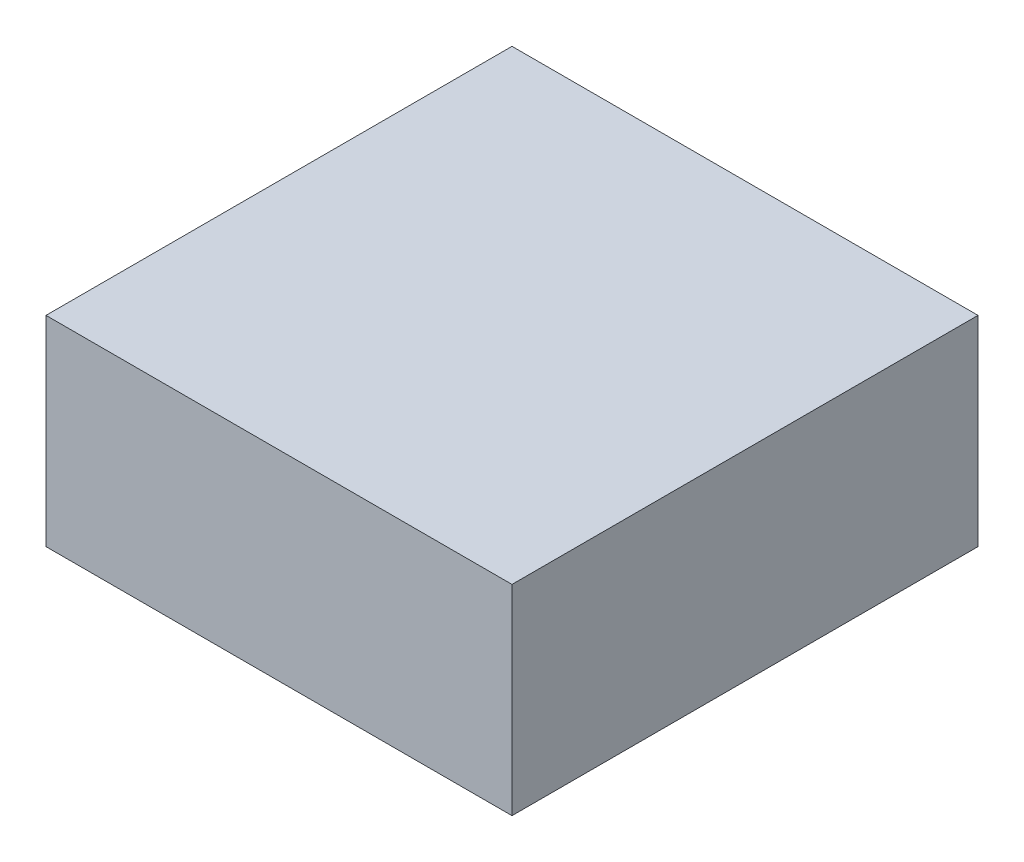
ISO-10303-21;
HEADER;
FILE_DESCRIPTION(('STEP AP214'),'2;1');
FILE_NAME('part.step','',(''),(''),'','','');
FILE_SCHEMA(('AUTOMOTIVE_DESIGN { 1 0 10303 214 1 1 1 1 }'));
ENDSEC;
DATA;
#1=APPLICATION_CONTEXT('core data for automotive mechanical design processes');
#2=APPLICATION_PROTOCOL_DEFINITION('international standard','automotive_design',2000,#1);
#3=PRODUCT_CONTEXT('',#1,'mechanical');
#4=PRODUCT('Part','Part','',(#3));
#5=PRODUCT_RELATED_PRODUCT_CATEGORY('part','',(#4));
#6=PRODUCT_DEFINITION_FORMATION('','',#4);
#7=PRODUCT_DEFINITION_CONTEXT('part definition',#1,'design');
#8=PRODUCT_DEFINITION('design','',#6,#7);
#9=PRODUCT_DEFINITION_SHAPE('','',#8);
#10=(LENGTH_UNIT() NAMED_UNIT(*) SI_UNIT(.MILLI.,.METRE.));
#11=(NAMED_UNIT(*) PLANE_ANGLE_UNIT() SI_UNIT($,.RADIAN.));
#12=(NAMED_UNIT(*) SI_UNIT($,.STERADIAN.) SOLID_ANGLE_UNIT());
#13=UNCERTAINTY_MEASURE_WITH_UNIT(LENGTH_MEASURE(1.E-05),#10,'distance_accuracy_value','');
#14=(GEOMETRIC_REPRESENTATION_CONTEXT(3) GLOBAL_UNCERTAINTY_ASSIGNED_CONTEXT((#13)) GLOBAL_UNIT_ASSIGNED_CONTEXT((#10,
#11,#12)) REPRESENTATION_CONTEXT('',''));
#15=CARTESIAN_POINT('',(0.,0.,0.));
#16=DIRECTION('',(0.,0.,1.));
#17=DIRECTION('',(1.,0.,0.));
#18=AXIS2_PLACEMENT_3D('',#15,#16,#17);
#19=CARTESIAN_POINT('',(0.,24.892,0.));
#20=DIRECTION('',(1.,0.,0.));
#21=DIRECTION('',(0.,0.,-1.));
#22=AXIS2_PLACEMENT_3D('',#19,#20,#21);
#23=PLANE('',#22);
#24=DIRECTION('',(0.,0.,1.));
#25=VECTOR('',#24,1.);
#26=CARTESIAN_POINT('',(0.,0.,0.));
#27=LINE('',#26,#25);
#28=CARTESIAN_POINT('',(0.,0.,-57.912));
#29=VERTEX_POINT('',#28);
#30=CARTESIAN_POINT('',(0.,0.,0.));
#31=VERTEX_POINT('',#30);
#32=EDGE_CURVE('E96',#29,#31,#27,.T.);
#33=ORIENTED_EDGE('',*,*,#32,.T.);
#34=DIRECTION('',(0.,-1.,0.));
#35=VECTOR('',#34,1.);
#36=CARTESIAN_POINT('',(0.,24.892,0.));
#37=LINE('',#36,#35);
#38=CARTESIAN_POINT('',(0.,24.892,0.));
#39=VERTEX_POINT('',#38);
#40=EDGE_CURVE('E11',#39,#31,#37,.T.);
#41=ORIENTED_EDGE('',*,*,#40,.F.);
#42=DIRECTION('',(0.,0.,1.));
#43=VECTOR('',#42,1.);
#44=CARTESIAN_POINT('',(0.,24.892,0.));
#45=LINE('',#44,#43);
#46=CARTESIAN_POINT('',(0.,24.892,-57.912));
#47=VERTEX_POINT('',#46);
#48=EDGE_CURVE('E84',#47,#39,#45,.T.);
#49=ORIENTED_EDGE('',*,*,#48,.F.);
#50=DIRECTION('',(0.,-1.,0.));
#51=VECTOR('',#50,1.);
#52=CARTESIAN_POINT('',(0.,24.892,-57.912));
#53=LINE('',#52,#51);
#54=EDGE_CURVE('E92',#47,#29,#53,.T.);
#55=ORIENTED_EDGE('',*,*,#54,.T.);
#56=EDGE_LOOP('',(#33,#41,#49,#55));
#57=FACE_BOUND('',#56,.T.);
#58=ADVANCED_FACE('F33',(#57),#23,.F.);
#59=CARTESIAN_POINT('',(0.,24.892,0.));
#60=DIRECTION('',(0.,0.,-1.));
#61=DIRECTION('',(-1.,0.,0.));
#62=AXIS2_PLACEMENT_3D('',#59,#60,#61);
#63=PLANE('',#62);
#64=DIRECTION('',(1.,0.,0.));
#65=VECTOR('',#64,1.);
#66=CARTESIAN_POINT('',(0.,0.,0.));
#67=LINE('',#66,#65);
#68=CARTESIAN_POINT('',(57.912,0.,0.));
#69=VERTEX_POINT('',#68);
#70=EDGE_CURVE('E88',#31,#69,#67,.T.);
#71=ORIENTED_EDGE('',*,*,#70,.T.);
#72=DIRECTION('',(0.,-1.,0.));
#73=VECTOR('',#72,1.);
#74=CARTESIAN_POINT('',(57.912,24.892,0.));
#75=LINE('',#74,#73);
#76=CARTESIAN_POINT('',(57.912,24.892,0.));
#77=VERTEX_POINT('',#76);
#78=EDGE_CURVE('E41',#77,#69,#75,.T.);
#79=ORIENTED_EDGE('',*,*,#78,.F.);
#80=DIRECTION('',(1.,0.,0.));
#81=VECTOR('',#80,1.);
#82=CARTESIAN_POINT('',(0.,24.892,0.));
#83=LINE('',#82,#81);
#84=EDGE_CURVE('E79',#39,#77,#83,.T.);
#85=ORIENTED_EDGE('',*,*,#84,.F.);
#86=ORIENTED_EDGE('',*,*,#40,.T.);
#87=EDGE_LOOP('',(#71,#79,#85,#86));
#88=FACE_BOUND('',#87,.T.);
#89=ADVANCED_FACE('F87',(#88),#63,.F.);
#90=CARTESIAN_POINT('',(57.912,24.892,0.));
#91=DIRECTION('',(-1.,0.,0.));
#92=DIRECTION('',(0.,0.,1.));
#93=AXIS2_PLACEMENT_3D('',#90,#91,#92);
#94=PLANE('',#93);
#95=DIRECTION('',(0.,0.,-1.));
#96=VECTOR('',#95,1.);
#97=CARTESIAN_POINT('',(57.912,0.,0.));
#98=LINE('',#97,#96);
#99=CARTESIAN_POINT('',(57.912,0.,-57.912));
#100=VERTEX_POINT('',#99);
#101=EDGE_CURVE('E66',#69,#100,#98,.T.);
#102=ORIENTED_EDGE('',*,*,#101,.T.);
#103=DIRECTION('',(0.,-1.,0.));
#104=VECTOR('',#103,1.);
#105=CARTESIAN_POINT('',(57.912,24.892,-57.912));
#106=LINE('',#105,#104);
#107=CARTESIAN_POINT('',(57.912,24.892,-57.912));
#108=VERTEX_POINT('',#107);
#109=EDGE_CURVE('E89',#108,#100,#106,.T.);
#110=ORIENTED_EDGE('',*,*,#109,.F.);
#111=DIRECTION('',(0.,0.,-1.));
#112=VECTOR('',#111,1.);
#113=CARTESIAN_POINT('',(57.912,24.892,0.));
#114=LINE('',#113,#112);
#115=EDGE_CURVE('E82',#77,#108,#114,.T.);
#116=ORIENTED_EDGE('',*,*,#115,.F.);
#117=ORIENTED_EDGE('',*,*,#78,.T.);
#118=EDGE_LOOP('',(#102,#110,#116,#117));
#119=FACE_BOUND('',#118,.T.);
#120=ADVANCED_FACE('F90',(#119),#94,.F.);
#121=CARTESIAN_POINT('',(0.,24.892,-57.912));
#122=DIRECTION('',(0.,0.,1.));
#123=DIRECTION('',(1.,0.,0.));
#124=AXIS2_PLACEMENT_3D('',#121,#122,#123);
#125=PLANE('',#124);
#126=DIRECTION('',(-1.,0.,0.));
#127=VECTOR('',#126,1.);
#128=CARTESIAN_POINT('',(0.,0.,-57.912));
#129=LINE('',#128,#127);
#130=EDGE_CURVE('E72',#100,#29,#129,.T.);
#131=ORIENTED_EDGE('',*,*,#130,.T.);
#132=ORIENTED_EDGE('',*,*,#54,.F.);
#133=DIRECTION('',(-1.,0.,0.));
#134=VECTOR('',#133,1.);
#135=CARTESIAN_POINT('',(0.,24.892,-57.912));
#136=LINE('',#135,#134);
#137=EDGE_CURVE('E49',#108,#47,#136,.T.);
#138=ORIENTED_EDGE('',*,*,#137,.F.);
#139=ORIENTED_EDGE('',*,*,#109,.T.);
#140=EDGE_LOOP('',(#131,#132,#138,#139));
#141=FACE_BOUND('',#140,.T.);
#142=ADVANCED_FACE('F103',(#141),#125,.F.);
#143=CARTESIAN_POINT('',(0.,24.892,0.));
#144=DIRECTION('',(0.,-1.,0.));
#145=DIRECTION('',(0.,0.,-1.));
#146=AXIS2_PLACEMENT_3D('',#143,#144,#145);
#147=PLANE('',#146);
#148=ORIENTED_EDGE('',*,*,#48,.T.);
#149=ORIENTED_EDGE('',*,*,#84,.T.);
#150=ORIENTED_EDGE('',*,*,#115,.T.);
#151=ORIENTED_EDGE('',*,*,#137,.T.);
#152=EDGE_LOOP('',(#148,#149,#150,#151));
#153=FACE_BOUND('',#152,.T.);
#154=ADVANCED_FACE('F80',(#153),#147,.F.);
#155=CARTESIAN_POINT('',(0.,0.,0.));
#156=DIRECTION('',(0.,-1.,0.));
#157=DIRECTION('',(0.,0.,-1.));
#158=AXIS2_PLACEMENT_3D('',#155,#156,#157);
#159=PLANE('',#158);
#160=ORIENTED_EDGE('',*,*,#32,.F.);
#161=ORIENTED_EDGE('',*,*,#130,.F.);
#162=ORIENTED_EDGE('',*,*,#101,.F.);
#163=ORIENTED_EDGE('',*,*,#70,.F.);
#164=EDGE_LOOP('',(#160,#161,#162,#163));
#165=FACE_BOUND('',#164,.T.);
#166=ADVANCED_FACE('F106',(#165),#159,.T.);
#167=CLOSED_SHELL('',(#58,#89,#120,#142,#154,#166));
#168=MANIFOLD_SOLID_BREP('B2',#167);
#169=ADVANCED_BREP_SHAPE_REPRESENTATION('',(#18,#168),#14);
#170=SHAPE_DEFINITION_REPRESENTATION(#9,#169);
ENDSEC;
END-ISO-10303-21;
